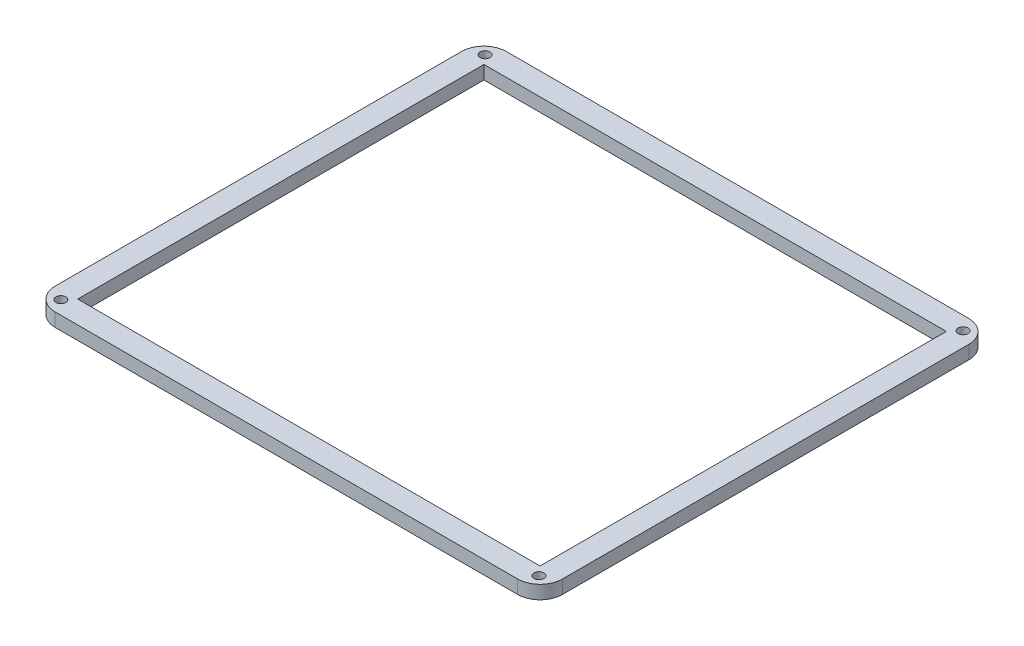
ISO-10303-21;
HEADER;
FILE_DESCRIPTION(('STEP AP214'),'2;1');
FILE_NAME('part.step','',(''),(''),'','','');
FILE_SCHEMA(('AUTOMOTIVE_DESIGN { 1 0 10303 214 1 1 1 1 }'));
ENDSEC;
DATA;
#1=APPLICATION_CONTEXT('core data for automotive mechanical design processes');
#2=APPLICATION_PROTOCOL_DEFINITION('international standard','automotive_design',2000,#1);
#3=PRODUCT_CONTEXT('',#1,'mechanical');
#4=PRODUCT('Part','Part','',(#3));
#5=PRODUCT_RELATED_PRODUCT_CATEGORY('part','',(#4));
#6=PRODUCT_DEFINITION_FORMATION('','',#4);
#7=PRODUCT_DEFINITION_CONTEXT('part definition',#1,'design');
#8=PRODUCT_DEFINITION('design','',#6,#7);
#9=PRODUCT_DEFINITION_SHAPE('','',#8);
#10=(LENGTH_UNIT() NAMED_UNIT(*) SI_UNIT(.MILLI.,.METRE.));
#11=(NAMED_UNIT(*) PLANE_ANGLE_UNIT() SI_UNIT($,.RADIAN.));
#12=(NAMED_UNIT(*) SI_UNIT($,.STERADIAN.) SOLID_ANGLE_UNIT());
#13=UNCERTAINTY_MEASURE_WITH_UNIT(LENGTH_MEASURE(1.E-05),#10,'distance_accuracy_value','');
#14=(GEOMETRIC_REPRESENTATION_CONTEXT(3) GLOBAL_UNCERTAINTY_ASSIGNED_CONTEXT((#13)) GLOBAL_UNIT_ASSIGNED_CONTEXT((#10,
#11,#12)) REPRESENTATION_CONTEXT('',''));
#15=CARTESIAN_POINT('',(0.,0.,0.));
#16=DIRECTION('',(0.,0.,1.));
#17=DIRECTION('',(1.,0.,0.));
#18=AXIS2_PLACEMENT_3D('',#15,#16,#17);
#19=CARTESIAN_POINT('',(-51.5,3.,45.25));
#20=DIRECTION('',(0.,-1.,0.));
#21=DIRECTION('',(0.,0.,-1.));
#22=AXIS2_PLACEMENT_3D('',#19,#20,#21);
#23=PLANE('',#22);
#24=CARTESIAN_POINT('',(-51.5,3.,45.25));
#25=DIRECTION('',(0.,1.,0.));
#26=DIRECTION('',(0.,0.,-1.));
#27=AXIS2_PLACEMENT_3D('',#24,#25,#26);
#28=CIRCLE('',#27,5.);
#29=CARTESIAN_POINT('',(-56.5,3.,45.25));
#30=VERTEX_POINT('',#29);
#31=CARTESIAN_POINT('',(-51.5,3.,50.25));
#32=VERTEX_POINT('',#31);
#33=EDGE_CURVE('E169',#30,#32,#28,.T.);
#34=ORIENTED_EDGE('',*,*,#33,.T.);
#35=DIRECTION('',(1.,0.,0.));
#36=VECTOR('',#35,1.);
#37=CARTESIAN_POINT('',(-51.5,3.,50.25));
#38=LINE('',#37,#36);
#39=CARTESIAN_POINT('',(51.4999999999999,3.,50.25));
#40=VERTEX_POINT('',#39);
#41=EDGE_CURVE('E172',#32,#40,#38,.T.);
#42=ORIENTED_EDGE('',*,*,#41,.T.);
#43=CARTESIAN_POINT('',(51.5,3.,45.25));
#44=DIRECTION('',(0.,1.,0.));
#45=DIRECTION('',(0.,0.,1.));
#46=AXIS2_PLACEMENT_3D('',#43,#44,#45);
#47=CIRCLE('',#46,5.);
#48=CARTESIAN_POINT('',(56.5,3.,45.25));
#49=VERTEX_POINT('',#48);
#50=EDGE_CURVE('E175',#40,#49,#47,.T.);
#51=ORIENTED_EDGE('',*,*,#50,.T.);
#52=DIRECTION('',(0.,0.,-1.));
#53=VECTOR('',#52,1.);
#54=CARTESIAN_POINT('',(56.5,3.,45.25));
#55=LINE('',#54,#53);
#56=CARTESIAN_POINT('',(56.5,3.,-45.2499999999999));
#57=VERTEX_POINT('',#56);
#58=EDGE_CURVE('E177',#49,#57,#55,.T.);
#59=ORIENTED_EDGE('',*,*,#58,.T.);
#60=CARTESIAN_POINT('',(51.5,3.,-45.25));
#61=DIRECTION('',(0.,1.,0.));
#62=DIRECTION('',(0.,0.,-1.));
#63=AXIS2_PLACEMENT_3D('',#60,#61,#62);
#64=CIRCLE('',#63,5.);
#65=CARTESIAN_POINT('',(51.4999999999999,3.,-50.25));
#66=VERTEX_POINT('',#65);
#67=EDGE_CURVE('E179',#57,#66,#64,.T.);
#68=ORIENTED_EDGE('',*,*,#67,.T.);
#69=DIRECTION('',(-1.,0.,0.));
#70=VECTOR('',#69,1.);
#71=CARTESIAN_POINT('',(-51.5,3.,-50.25));
#72=LINE('',#71,#70);
#73=CARTESIAN_POINT('',(-51.5,3.,-50.25));
#74=VERTEX_POINT('',#73);
#75=EDGE_CURVE('E181',#66,#74,#72,.T.);
#76=ORIENTED_EDGE('',*,*,#75,.T.);
#77=CARTESIAN_POINT('',(-51.5,3.,-45.25));
#78=DIRECTION('',(0.,1.,0.));
#79=DIRECTION('',(0.,0.,-1.));
#80=AXIS2_PLACEMENT_3D('',#77,#78,#79);
#81=CIRCLE('',#80,5.);
#82=CARTESIAN_POINT('',(-56.5,3.,-45.2499999999999));
#83=VERTEX_POINT('',#82);
#84=EDGE_CURVE('E183',#74,#83,#81,.T.);
#85=ORIENTED_EDGE('',*,*,#84,.T.);
#86=DIRECTION('',(0.,0.,1.));
#87=VECTOR('',#86,1.);
#88=CARTESIAN_POINT('',(-56.5,3.,45.25));
#89=LINE('',#88,#87);
#90=EDGE_CURVE('E185',#83,#30,#89,.T.);
#91=ORIENTED_EDGE('',*,*,#90,.T.);
#92=EDGE_LOOP('',(#34,#42,#51,#59,#68,#76,#85,#91));
#93=FACE_BOUND('',#92,.T.);
#94=DIRECTION('',(0.,0.,-1.));
#95=VECTOR('',#94,1.);
#96=CARTESIAN_POINT('',(51.5,3.,45.25));
#97=LINE('',#96,#95);
#98=CARTESIAN_POINT('',(51.5,3.,45.25));
#99=VERTEX_POINT('',#98);
#100=CARTESIAN_POINT('',(51.5,3.,-45.25));
#101=VERTEX_POINT('',#100);
#102=EDGE_CURVE('E130',#99,#101,#97,.T.);
#103=ORIENTED_EDGE('',*,*,#102,.F.);
#104=DIRECTION('',(1.,0.,0.));
#105=VECTOR('',#104,1.);
#106=CARTESIAN_POINT('',(-51.5,3.,45.25));
#107=LINE('',#106,#105);
#108=CARTESIAN_POINT('',(-51.5,3.,45.25));
#109=VERTEX_POINT('',#108);
#110=EDGE_CURVE('E153',#109,#99,#107,.T.);
#111=ORIENTED_EDGE('',*,*,#110,.F.);
#112=DIRECTION('',(0.,0.,1.));
#113=VECTOR('',#112,1.);
#114=CARTESIAN_POINT('',(-51.5,3.,45.25));
#115=LINE('',#114,#113);
#116=CARTESIAN_POINT('',(-51.5,3.,-45.25));
#117=VERTEX_POINT('',#116);
#118=EDGE_CURVE('E151',#117,#109,#115,.T.);
#119=ORIENTED_EDGE('',*,*,#118,.F.);
#120=DIRECTION('',(-1.,0.,0.));
#121=VECTOR('',#120,1.);
#122=CARTESIAN_POINT('',(-51.5,3.,-45.25));
#123=LINE('',#122,#121);
#124=EDGE_CURVE('E138',#101,#117,#123,.T.);
#125=ORIENTED_EDGE('',*,*,#124,.F.);
#126=EDGE_LOOP('',(#103,#111,#119,#125));
#127=FACE_BOUND('',#126,.T.);
#128=CARTESIAN_POINT('',(-53.25,3.,-47.25));
#129=DIRECTION('',(0.,1.,0.));
#130=DIRECTION('',(0.,0.,1.));
#131=AXIS2_PLACEMENT_3D('',#128,#129,#130);
#132=CIRCLE('',#131,1.1);
#133=CARTESIAN_POINT('',(-53.25,3.,-46.15));
#134=VERTEX_POINT('',#133);
#135=EDGE_CURVE('E159',#134,#134,#132,.T.);
#136=ORIENTED_EDGE('',*,*,#135,.F.);
#137=EDGE_LOOP('',(#136));
#138=FACE_BOUND('',#137,.T.);
#139=CARTESIAN_POINT('',(53.25,3.,-47.25));
#140=DIRECTION('',(0.,1.,0.));
#141=DIRECTION('',(0.,0.,1.));
#142=AXIS2_PLACEMENT_3D('',#139,#140,#141);
#143=CIRCLE('',#142,1.1);
#144=CARTESIAN_POINT('',(53.25,3.,-46.15));
#145=VERTEX_POINT('',#144);
#146=EDGE_CURVE('E331',#145,#145,#143,.T.);
#147=ORIENTED_EDGE('',*,*,#146,.F.);
#148=EDGE_LOOP('',(#147));
#149=FACE_BOUND('',#148,.T.);
#150=CARTESIAN_POINT('',(53.25,3.,47.25));
#151=DIRECTION('',(0.,1.,0.));
#152=DIRECTION('',(0.,0.,-1.));
#153=AXIS2_PLACEMENT_3D('',#150,#151,#152);
#154=CIRCLE('',#153,1.1);
#155=CARTESIAN_POINT('',(53.25,3.,46.15));
#156=VERTEX_POINT('',#155);
#157=EDGE_CURVE('E325',#156,#156,#154,.T.);
#158=ORIENTED_EDGE('',*,*,#157,.F.);
#159=EDGE_LOOP('',(#158));
#160=FACE_BOUND('',#159,.T.);
#161=CARTESIAN_POINT('',(-53.25,3.,47.25));
#162=DIRECTION('',(0.,1.,0.));
#163=DIRECTION('',(0.,0.,-1.));
#164=AXIS2_PLACEMENT_3D('',#161,#162,#163);
#165=CIRCLE('',#164,1.10000000000001);
#166=CARTESIAN_POINT('',(-53.25,3.,46.15));
#167=VERTEX_POINT('',#166);
#168=EDGE_CURVE('E316',#167,#167,#165,.T.);
#169=ORIENTED_EDGE('',*,*,#168,.F.);
#170=EDGE_LOOP('',(#169));
#171=FACE_BOUND('',#170,.T.);
#172=ADVANCED_FACE('F41',(#93,#127,#138,#149,#160,#171),#23,.F.);
#173=CARTESIAN_POINT('',(-51.5,0.,45.25));
#174=DIRECTION('',(0.,-1.,0.));
#175=DIRECTION('',(0.,0.,-1.));
#176=AXIS2_PLACEMENT_3D('',#173,#174,#175);
#177=PLANE('',#176);
#178=CARTESIAN_POINT('',(53.25,0.,47.25));
#179=DIRECTION('',(0.,1.,0.));
#180=DIRECTION('',(0.,0.,-1.));
#181=AXIS2_PLACEMENT_3D('',#178,#179,#180);
#182=CIRCLE('',#181,1.1);
#183=CARTESIAN_POINT('',(53.25,0.,46.15));
#184=VERTEX_POINT('',#183);
#185=EDGE_CURVE('E322',#184,#184,#182,.T.);
#186=ORIENTED_EDGE('',*,*,#185,.T.);
#187=EDGE_LOOP('',(#186));
#188=FACE_BOUND('',#187,.T.);
#189=CARTESIAN_POINT('',(-53.25,0.,-47.25));
#190=DIRECTION('',(0.,1.,0.));
#191=DIRECTION('',(0.,0.,1.));
#192=AXIS2_PLACEMENT_3D('',#189,#190,#191);
#193=CIRCLE('',#192,1.1);
#194=CARTESIAN_POINT('',(-53.25,0.,-46.15));
#195=VERTEX_POINT('',#194);
#196=EDGE_CURVE('E334',#195,#195,#193,.T.);
#197=ORIENTED_EDGE('',*,*,#196,.T.);
#198=EDGE_LOOP('',(#197));
#199=FACE_BOUND('',#198,.T.);
#200=CARTESIAN_POINT('',(-51.5,0.,45.25));
#201=DIRECTION('',(0.,1.,0.));
#202=DIRECTION('',(0.,0.,-1.));
#203=AXIS2_PLACEMENT_3D('',#200,#201,#202);
#204=CIRCLE('',#203,5.);
#205=CARTESIAN_POINT('',(-56.5,0.,45.25));
#206=VERTEX_POINT('',#205);
#207=CARTESIAN_POINT('',(-51.5,0.,50.25));
#208=VERTEX_POINT('',#207);
#209=EDGE_CURVE('E146',#206,#208,#204,.T.);
#210=ORIENTED_EDGE('',*,*,#209,.F.);
#211=DIRECTION('',(0.,0.,1.));
#212=VECTOR('',#211,1.);
#213=CARTESIAN_POINT('',(-56.5,0.,45.25));
#214=LINE('',#213,#212);
#215=CARTESIAN_POINT('',(-56.5,0.,-45.2499999999999));
#216=VERTEX_POINT('',#215);
#217=EDGE_CURVE('E173',#216,#206,#214,.T.);
#218=ORIENTED_EDGE('',*,*,#217,.F.);
#219=CARTESIAN_POINT('',(-51.5,0.,-45.25));
#220=DIRECTION('',(0.,1.,0.));
#221=DIRECTION('',(0.,0.,-1.));
#222=AXIS2_PLACEMENT_3D('',#219,#220,#221);
#223=CIRCLE('',#222,5.);
#224=CARTESIAN_POINT('',(-51.5,0.,-50.25));
#225=VERTEX_POINT('',#224);
#226=EDGE_CURVE('E200',#225,#216,#223,.T.);
#227=ORIENTED_EDGE('',*,*,#226,.F.);
#228=DIRECTION('',(-1.,0.,0.));
#229=VECTOR('',#228,1.);
#230=CARTESIAN_POINT('',(-51.5,0.,-50.25));
#231=LINE('',#230,#229);
#232=CARTESIAN_POINT('',(51.4999999999999,0.,-50.25));
#233=VERTEX_POINT('',#232);
#234=EDGE_CURVE('E198',#233,#225,#231,.T.);
#235=ORIENTED_EDGE('',*,*,#234,.F.);
#236=CARTESIAN_POINT('',(51.5,0.,-45.25));
#237=DIRECTION('',(0.,1.,0.));
#238=DIRECTION('',(0.,0.,-1.));
#239=AXIS2_PLACEMENT_3D('',#236,#237,#238);
#240=CIRCLE('',#239,5.);
#241=CARTESIAN_POINT('',(56.5,0.,-45.2499999999999));
#242=VERTEX_POINT('',#241);
#243=EDGE_CURVE('E196',#242,#233,#240,.T.);
#244=ORIENTED_EDGE('',*,*,#243,.F.);
#245=DIRECTION('',(0.,0.,-1.));
#246=VECTOR('',#245,1.);
#247=CARTESIAN_POINT('',(56.5,0.,45.25));
#248=LINE('',#247,#246);
#249=CARTESIAN_POINT('',(56.5,0.,45.25));
#250=VERTEX_POINT('',#249);
#251=EDGE_CURVE('E194',#250,#242,#248,.T.);
#252=ORIENTED_EDGE('',*,*,#251,.F.);
#253=CARTESIAN_POINT('',(51.5,0.,45.25));
#254=DIRECTION('',(0.,1.,0.));
#255=DIRECTION('',(0.,0.,1.));
#256=AXIS2_PLACEMENT_3D('',#253,#254,#255);
#257=CIRCLE('',#256,5.);
#258=CARTESIAN_POINT('',(51.4999999999999,0.,50.25));
#259=VERTEX_POINT('',#258);
#260=EDGE_CURVE('E192',#259,#250,#257,.T.);
#261=ORIENTED_EDGE('',*,*,#260,.F.);
#262=DIRECTION('',(1.,0.,0.));
#263=VECTOR('',#262,1.);
#264=CARTESIAN_POINT('',(-51.5,0.,50.25));
#265=LINE('',#264,#263);
#266=EDGE_CURVE('E190',#208,#259,#265,.T.);
#267=ORIENTED_EDGE('',*,*,#266,.F.);
#268=EDGE_LOOP('',(#210,#218,#227,#235,#244,#252,#261,#267));
#269=FACE_BOUND('',#268,.T.);
#270=DIRECTION('',(1.,0.,0.));
#271=VECTOR('',#270,1.);
#272=CARTESIAN_POINT('',(-51.5,0.,45.25));
#273=LINE('',#272,#271);
#274=CARTESIAN_POINT('',(-51.5,0.,45.25));
#275=VERTEX_POINT('',#274);
#276=CARTESIAN_POINT('',(51.5,0.,45.25));
#277=VERTEX_POINT('',#276);
#278=EDGE_CURVE('E139',#275,#277,#273,.T.);
#279=ORIENTED_EDGE('',*,*,#278,.T.);
#280=DIRECTION('',(0.,0.,-1.));
#281=VECTOR('',#280,1.);
#282=CARTESIAN_POINT('',(51.5,0.,45.25));
#283=LINE('',#282,#281);
#284=CARTESIAN_POINT('',(51.5,0.,-45.25));
#285=VERTEX_POINT('',#284);
#286=EDGE_CURVE('E64',#277,#285,#283,.T.);
#287=ORIENTED_EDGE('',*,*,#286,.T.);
#288=DIRECTION('',(-1.,0.,0.));
#289=VECTOR('',#288,1.);
#290=CARTESIAN_POINT('',(-51.5,0.,-45.25));
#291=LINE('',#290,#289);
#292=CARTESIAN_POINT('',(-51.5,0.,-45.25));
#293=VERTEX_POINT('',#292);
#294=EDGE_CURVE('E145',#285,#293,#291,.T.);
#295=ORIENTED_EDGE('',*,*,#294,.T.);
#296=DIRECTION('',(0.,0.,1.));
#297=VECTOR('',#296,1.);
#298=CARTESIAN_POINT('',(-51.5,0.,45.25));
#299=LINE('',#298,#297);
#300=EDGE_CURVE('E161',#293,#275,#299,.T.);
#301=ORIENTED_EDGE('',*,*,#300,.T.);
#302=EDGE_LOOP('',(#279,#287,#295,#301));
#303=FACE_BOUND('',#302,.T.);
#304=CARTESIAN_POINT('',(53.25,0.,-47.25));
#305=DIRECTION('',(0.,1.,0.));
#306=DIRECTION('',(0.,0.,1.));
#307=AXIS2_PLACEMENT_3D('',#304,#305,#306);
#308=CIRCLE('',#307,1.1);
#309=CARTESIAN_POINT('',(53.25,0.,-46.15));
#310=VERTEX_POINT('',#309);
#311=EDGE_CURVE('E328',#310,#310,#308,.T.);
#312=ORIENTED_EDGE('',*,*,#311,.T.);
#313=EDGE_LOOP('',(#312));
#314=FACE_BOUND('',#313,.T.);
#315=CARTESIAN_POINT('',(-53.25,0.,47.25));
#316=DIRECTION('',(0.,1.,0.));
#317=DIRECTION('',(0.,0.,-1.));
#318=AXIS2_PLACEMENT_3D('',#315,#316,#317);
#319=CIRCLE('',#318,1.10000000000001);
#320=CARTESIAN_POINT('',(-53.25,0.,46.15));
#321=VERTEX_POINT('',#320);
#322=EDGE_CURVE('E319',#321,#321,#319,.T.);
#323=ORIENTED_EDGE('',*,*,#322,.T.);
#324=EDGE_LOOP('',(#323));
#325=FACE_BOUND('',#324,.T.);
#326=ADVANCED_FACE('F230',(#188,#199,#269,#303,#314,#325),#177,.T.);
#327=CARTESIAN_POINT('',(-51.5,3.,45.25));
#328=DIRECTION('',(0.,-1.,0.));
#329=DIRECTION('',(0.,0.,-1.));
#330=AXIS2_PLACEMENT_3D('',#327,#328,#329);
#331=CYLINDRICAL_SURFACE('',#330,5.);
#332=ORIENTED_EDGE('',*,*,#209,.T.);
#333=DIRECTION('',(0.,-1.,0.));
#334=VECTOR('',#333,1.);
#335=CARTESIAN_POINT('',(-51.5,3.,50.25));
#336=LINE('',#335,#334);
#337=EDGE_CURVE('E11',#32,#208,#336,.T.);
#338=ORIENTED_EDGE('',*,*,#337,.F.);
#339=ORIENTED_EDGE('',*,*,#33,.F.);
#340=DIRECTION('',(0.,-1.,0.));
#341=VECTOR('',#340,1.);
#342=CARTESIAN_POINT('',(-56.5,3.,45.25));
#343=LINE('',#342,#341);
#344=EDGE_CURVE('E187',#30,#206,#343,.T.);
#345=ORIENTED_EDGE('',*,*,#344,.T.);
#346=EDGE_LOOP('',(#332,#338,#339,#345));
#347=FACE_BOUND('',#346,.T.);
#348=ADVANCED_FACE('F43',(#347),#331,.T.);
#349=CARTESIAN_POINT('',(-51.5,3.,50.25));
#350=DIRECTION('',(0.,0.,-1.));
#351=DIRECTION('',(-1.,0.,0.));
#352=AXIS2_PLACEMENT_3D('',#349,#350,#351);
#353=PLANE('',#352);
#354=ORIENTED_EDGE('',*,*,#266,.T.);
#355=DIRECTION('',(0.,-1.,0.));
#356=VECTOR('',#355,1.);
#357=CARTESIAN_POINT('',(51.4999999999999,3.,50.25));
#358=LINE('',#357,#356);
#359=EDGE_CURVE('E49',#40,#259,#358,.T.);
#360=ORIENTED_EDGE('',*,*,#359,.F.);
#361=ORIENTED_EDGE('',*,*,#41,.F.);
#362=ORIENTED_EDGE('',*,*,#337,.T.);
#363=EDGE_LOOP('',(#354,#360,#361,#362));
#364=FACE_BOUND('',#363,.T.);
#365=ADVANCED_FACE('F247',(#364),#353,.F.);
#366=CARTESIAN_POINT('',(51.5,3.,45.25));
#367=DIRECTION('',(0.,-1.,0.));
#368=DIRECTION('',(0.,0.,-1.));
#369=AXIS2_PLACEMENT_3D('',#366,#367,#368);
#370=CYLINDRICAL_SURFACE('',#369,5.);
#371=ORIENTED_EDGE('',*,*,#260,.T.);
#372=DIRECTION('',(0.,-1.,0.));
#373=VECTOR('',#372,1.);
#374=CARTESIAN_POINT('',(56.5,3.,45.25));
#375=LINE('',#374,#373);
#376=EDGE_CURVE('E217',#49,#250,#375,.T.);
#377=ORIENTED_EDGE('',*,*,#376,.F.);
#378=ORIENTED_EDGE('',*,*,#50,.F.);
#379=ORIENTED_EDGE('',*,*,#359,.T.);
#380=EDGE_LOOP('',(#371,#377,#378,#379));
#381=FACE_BOUND('',#380,.T.);
#382=ADVANCED_FACE('F224',(#381),#370,.T.);
#383=CARTESIAN_POINT('',(56.5,3.,45.25));
#384=DIRECTION('',(-1.,0.,0.));
#385=DIRECTION('',(0.,0.,1.));
#386=AXIS2_PLACEMENT_3D('',#383,#384,#385);
#387=PLANE('',#386);
#388=ORIENTED_EDGE('',*,*,#251,.T.);
#389=DIRECTION('',(0.,-1.,0.));
#390=VECTOR('',#389,1.);
#391=CARTESIAN_POINT('',(56.5,3.,-45.2499999999999));
#392=LINE('',#391,#390);
#393=EDGE_CURVE('E214',#57,#242,#392,.T.);
#394=ORIENTED_EDGE('',*,*,#393,.F.);
#395=ORIENTED_EDGE('',*,*,#58,.F.);
#396=ORIENTED_EDGE('',*,*,#376,.T.);
#397=EDGE_LOOP('',(#388,#394,#395,#396));
#398=FACE_BOUND('',#397,.T.);
#399=ADVANCED_FACE('F236',(#398),#387,.F.);
#400=CARTESIAN_POINT('',(51.5,3.,-45.25));
#401=DIRECTION('',(0.,-1.,0.));
#402=DIRECTION('',(0.,0.,-1.));
#403=AXIS2_PLACEMENT_3D('',#400,#401,#402);
#404=CYLINDRICAL_SURFACE('',#403,5.);
#405=ORIENTED_EDGE('',*,*,#243,.T.);
#406=DIRECTION('',(0.,-1.,0.));
#407=VECTOR('',#406,1.);
#408=CARTESIAN_POINT('',(51.4999999999999,3.,-50.25));
#409=LINE('',#408,#407);
#410=EDGE_CURVE('E211',#66,#233,#409,.T.);
#411=ORIENTED_EDGE('',*,*,#410,.F.);
#412=ORIENTED_EDGE('',*,*,#67,.F.);
#413=ORIENTED_EDGE('',*,*,#393,.T.);
#414=EDGE_LOOP('',(#405,#411,#412,#413));
#415=FACE_BOUND('',#414,.T.);
#416=ADVANCED_FACE('F240',(#415),#404,.T.);
#417=CARTESIAN_POINT('',(-51.5,3.,-50.25));
#418=DIRECTION('',(0.,0.,1.));
#419=DIRECTION('',(1.,0.,0.));
#420=AXIS2_PLACEMENT_3D('',#417,#418,#419);
#421=PLANE('',#420);
#422=ORIENTED_EDGE('',*,*,#234,.T.);
#423=DIRECTION('',(0.,-1.,0.));
#424=VECTOR('',#423,1.);
#425=CARTESIAN_POINT('',(-51.5,3.,-50.25));
#426=LINE('',#425,#424);
#427=EDGE_CURVE('E208',#74,#225,#426,.T.);
#428=ORIENTED_EDGE('',*,*,#427,.F.);
#429=ORIENTED_EDGE('',*,*,#75,.F.);
#430=ORIENTED_EDGE('',*,*,#410,.T.);
#431=EDGE_LOOP('',(#422,#428,#429,#430));
#432=FACE_BOUND('',#431,.T.);
#433=ADVANCED_FACE('F260',(#432),#421,.F.);
#434=CARTESIAN_POINT('',(-51.5,3.,-45.25));
#435=DIRECTION('',(0.,-1.,0.));
#436=DIRECTION('',(0.,0.,-1.));
#437=AXIS2_PLACEMENT_3D('',#434,#435,#436);
#438=CYLINDRICAL_SURFACE('',#437,5.);
#439=ORIENTED_EDGE('',*,*,#226,.T.);
#440=DIRECTION('',(0.,-1.,0.));
#441=VECTOR('',#440,1.);
#442=CARTESIAN_POINT('',(-56.5,3.,-45.2499999999999));
#443=LINE('',#442,#441);
#444=EDGE_CURVE('E205',#83,#216,#443,.T.);
#445=ORIENTED_EDGE('',*,*,#444,.F.);
#446=ORIENTED_EDGE('',*,*,#84,.F.);
#447=ORIENTED_EDGE('',*,*,#427,.T.);
#448=EDGE_LOOP('',(#439,#445,#446,#447));
#449=FACE_BOUND('',#448,.T.);
#450=ADVANCED_FACE('F258',(#449),#438,.T.);
#451=CARTESIAN_POINT('',(-56.5,3.,45.25));
#452=DIRECTION('',(1.,0.,0.));
#453=DIRECTION('',(0.,0.,-1.));
#454=AXIS2_PLACEMENT_3D('',#451,#452,#453);
#455=PLANE('',#454);
#456=ORIENTED_EDGE('',*,*,#217,.T.);
#457=ORIENTED_EDGE('',*,*,#344,.F.);
#458=ORIENTED_EDGE('',*,*,#90,.F.);
#459=ORIENTED_EDGE('',*,*,#444,.T.);
#460=EDGE_LOOP('',(#456,#457,#458,#459));
#461=FACE_BOUND('',#460,.T.);
#462=ADVANCED_FACE('F253',(#461),#455,.F.);
#463=CARTESIAN_POINT('',(51.5,3.,45.25));
#464=DIRECTION('',(-1.,0.,0.));
#465=DIRECTION('',(0.,0.,1.));
#466=AXIS2_PLACEMENT_3D('',#463,#464,#465);
#467=PLANE('',#466);
#468=ORIENTED_EDGE('',*,*,#286,.F.);
#469=DIRECTION('',(0.,-1.,0.));
#470=VECTOR('',#469,1.);
#471=CARTESIAN_POINT('',(51.5,3.,45.25));
#472=LINE('',#471,#470);
#473=EDGE_CURVE('E134',#99,#277,#472,.T.);
#474=ORIENTED_EDGE('',*,*,#473,.F.);
#475=ORIENTED_EDGE('',*,*,#102,.T.);
#476=DIRECTION('',(0.,-1.,0.));
#477=VECTOR('',#476,1.);
#478=CARTESIAN_POINT('',(51.5,3.,-45.25));
#479=LINE('',#478,#477);
#480=EDGE_CURVE('E133',#101,#285,#479,.T.);
#481=ORIENTED_EDGE('',*,*,#480,.T.);
#482=EDGE_LOOP('',(#468,#474,#475,#481));
#483=FACE_BOUND('',#482,.T.);
#484=ADVANCED_FACE('F132',(#483),#467,.T.);
#485=CARTESIAN_POINT('',(-51.5,3.,-45.25));
#486=DIRECTION('',(0.,0.,1.));
#487=DIRECTION('',(1.,0.,0.));
#488=AXIS2_PLACEMENT_3D('',#485,#486,#487);
#489=PLANE('',#488);
#490=ORIENTED_EDGE('',*,*,#294,.F.);
#491=ORIENTED_EDGE('',*,*,#480,.F.);
#492=ORIENTED_EDGE('',*,*,#124,.T.);
#493=DIRECTION('',(0.,-1.,0.));
#494=VECTOR('',#493,1.);
#495=CARTESIAN_POINT('',(-51.5,3.,-45.25));
#496=LINE('',#495,#494);
#497=EDGE_CURVE('E147',#117,#293,#496,.T.);
#498=ORIENTED_EDGE('',*,*,#497,.T.);
#499=EDGE_LOOP('',(#490,#491,#492,#498));
#500=FACE_BOUND('',#499,.T.);
#501=ADVANCED_FACE('F142',(#500),#489,.T.);
#502=CARTESIAN_POINT('',(-51.5,3.,45.25));
#503=DIRECTION('',(1.,0.,0.));
#504=DIRECTION('',(0.,0.,-1.));
#505=AXIS2_PLACEMENT_3D('',#502,#503,#504);
#506=PLANE('',#505);
#507=ORIENTED_EDGE('',*,*,#300,.F.);
#508=ORIENTED_EDGE('',*,*,#497,.F.);
#509=ORIENTED_EDGE('',*,*,#118,.T.);
#510=DIRECTION('',(0.,-1.,0.));
#511=VECTOR('',#510,1.);
#512=CARTESIAN_POINT('',(-51.5,3.,45.25));
#513=LINE('',#512,#511);
#514=EDGE_CURVE('E56',#109,#275,#513,.T.);
#515=ORIENTED_EDGE('',*,*,#514,.T.);
#516=EDGE_LOOP('',(#507,#508,#509,#515));
#517=FACE_BOUND('',#516,.T.);
#518=ADVANCED_FACE('F286',(#517),#506,.T.);
#519=CARTESIAN_POINT('',(-51.5,3.,45.25));
#520=DIRECTION('',(0.,0.,-1.));
#521=DIRECTION('',(-1.,0.,0.));
#522=AXIS2_PLACEMENT_3D('',#519,#520,#521);
#523=PLANE('',#522);
#524=ORIENTED_EDGE('',*,*,#278,.F.);
#525=ORIENTED_EDGE('',*,*,#514,.F.);
#526=ORIENTED_EDGE('',*,*,#110,.T.);
#527=ORIENTED_EDGE('',*,*,#473,.T.);
#528=EDGE_LOOP('',(#524,#525,#526,#527));
#529=FACE_BOUND('',#528,.T.);
#530=ADVANCED_FACE('F290',(#529),#523,.T.);
#531=CARTESIAN_POINT('',(-53.25,3.,-47.25));
#532=DIRECTION('',(0.,-1.,0.));
#533=DIRECTION('',(0.,0.,-1.));
#534=AXIS2_PLACEMENT_3D('',#531,#532,#533);
#535=CYLINDRICAL_SURFACE('',#534,1.1);
#536=ORIENTED_EDGE('',*,*,#135,.T.);
#537=EDGE_LOOP('',(#536));
#538=FACE_BOUND('',#537,.T.);
#539=ORIENTED_EDGE('',*,*,#196,.F.);
#540=EDGE_LOOP('',(#539));
#541=FACE_BOUND('',#540,.T.);
#542=ADVANCED_FACE('F296',(#538,#541),#535,.F.);
#543=CARTESIAN_POINT('',(53.25,3.,-47.25));
#544=DIRECTION('',(0.,-1.,0.));
#545=DIRECTION('',(0.,0.,-1.));
#546=AXIS2_PLACEMENT_3D('',#543,#544,#545);
#547=CYLINDRICAL_SURFACE('',#546,1.1);
#548=ORIENTED_EDGE('',*,*,#146,.T.);
#549=EDGE_LOOP('',(#548));
#550=FACE_BOUND('',#549,.T.);
#551=ORIENTED_EDGE('',*,*,#311,.F.);
#552=EDGE_LOOP('',(#551));
#553=FACE_BOUND('',#552,.T.);
#554=ADVANCED_FACE('F299',(#550,#553),#547,.F.);
#555=CARTESIAN_POINT('',(53.25,3.,47.25));
#556=DIRECTION('',(0.,-1.,0.));
#557=DIRECTION('',(0.,0.,-1.));
#558=AXIS2_PLACEMENT_3D('',#555,#556,#557);
#559=CYLINDRICAL_SURFACE('',#558,1.1);
#560=ORIENTED_EDGE('',*,*,#157,.T.);
#561=EDGE_LOOP('',(#560));
#562=FACE_BOUND('',#561,.T.);
#563=ORIENTED_EDGE('',*,*,#185,.F.);
#564=EDGE_LOOP('',(#563));
#565=FACE_BOUND('',#564,.T.);
#566=ADVANCED_FACE('F303',(#562,#565),#559,.F.);
#567=CARTESIAN_POINT('',(-53.25,3.,47.25));
#568=DIRECTION('',(0.,-1.,0.));
#569=DIRECTION('',(0.,0.,-1.));
#570=AXIS2_PLACEMENT_3D('',#567,#568,#569);
#571=CYLINDRICAL_SURFACE('',#570,1.10000000000001);
#572=ORIENTED_EDGE('',*,*,#168,.T.);
#573=EDGE_LOOP('',(#572));
#574=FACE_BOUND('',#573,.T.);
#575=ORIENTED_EDGE('',*,*,#322,.F.);
#576=EDGE_LOOP('',(#575));
#577=FACE_BOUND('',#576,.T.);
#578=ADVANCED_FACE('F307',(#574,#577),#571,.F.);
#579=CLOSED_SHELL('',(#172,#326,#348,#365,#382,#399,#416,#433,#450,#462,#484,#501,#518,#530,
#542,#554,#566,#578));
#580=MANIFOLD_SOLID_BREP('B2',#579);
#581=ADVANCED_BREP_SHAPE_REPRESENTATION('',(#18,#580),#14);
#582=SHAPE_DEFINITION_REPRESENTATION(#9,#581);
ENDSEC;
END-ISO-10303-21;
